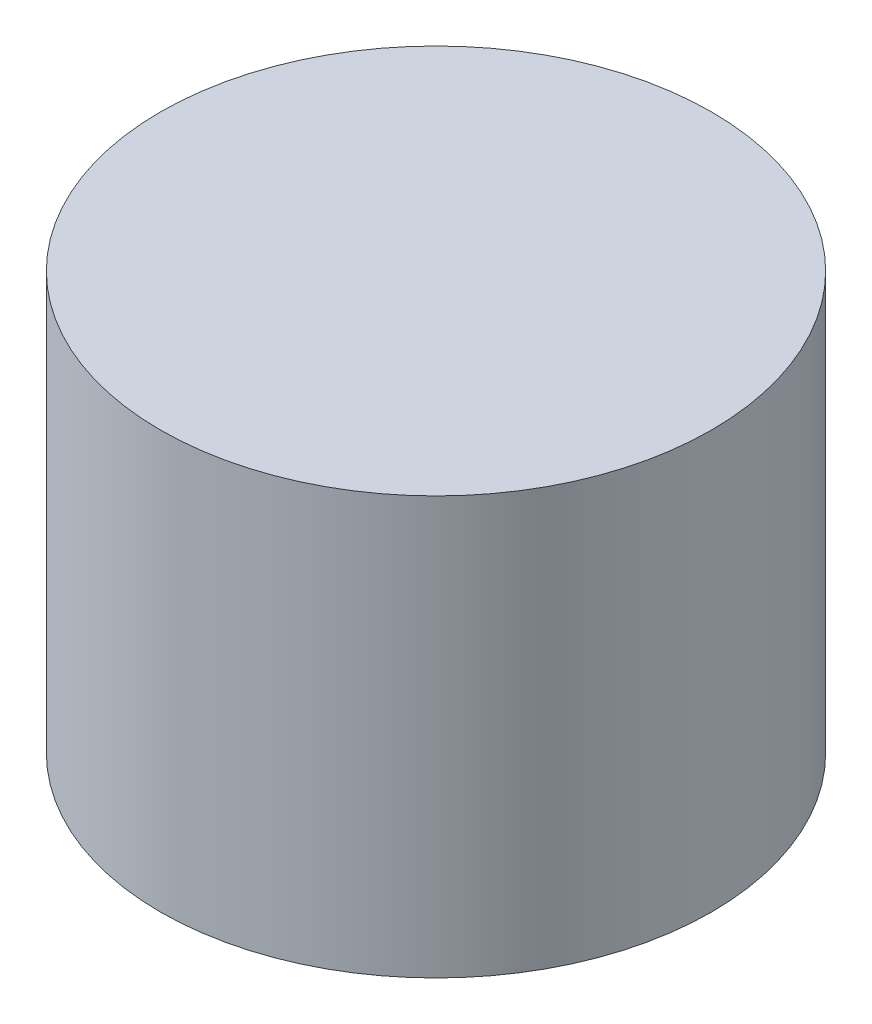
ISO-10303-21;
HEADER;
FILE_DESCRIPTION(('STEP AP214'),'2;1');
FILE_NAME('part.step','',(''),(''),'','','');
FILE_SCHEMA(('AUTOMOTIVE_DESIGN { 1 0 10303 214 1 1 1 1 }'));
ENDSEC;
DATA;
#1=APPLICATION_CONTEXT('core data for automotive mechanical design processes');
#2=APPLICATION_PROTOCOL_DEFINITION('international standard','automotive_design',2000,#1);
#3=PRODUCT_CONTEXT('',#1,'mechanical');
#4=PRODUCT('Part','Part','',(#3));
#5=PRODUCT_RELATED_PRODUCT_CATEGORY('part','',(#4));
#6=PRODUCT_DEFINITION_FORMATION('','',#4);
#7=PRODUCT_DEFINITION_CONTEXT('part definition',#1,'design');
#8=PRODUCT_DEFINITION('design','',#6,#7);
#9=PRODUCT_DEFINITION_SHAPE('','',#8);
#10=(LENGTH_UNIT() NAMED_UNIT(*) SI_UNIT(.MILLI.,.METRE.));
#11=(NAMED_UNIT(*) PLANE_ANGLE_UNIT() SI_UNIT($,.RADIAN.));
#12=(NAMED_UNIT(*) SI_UNIT($,.STERADIAN.) SOLID_ANGLE_UNIT());
#13=UNCERTAINTY_MEASURE_WITH_UNIT(LENGTH_MEASURE(1.E-05),#10,'distance_accuracy_value','');
#14=(GEOMETRIC_REPRESENTATION_CONTEXT(3) GLOBAL_UNCERTAINTY_ASSIGNED_CONTEXT((#13)) GLOBAL_UNIT_ASSIGNED_CONTEXT((#10,
#11,#12)) REPRESENTATION_CONTEXT('',''));
#15=CARTESIAN_POINT('',(0.,0.,0.));
#16=DIRECTION('',(0.,0.,1.));
#17=DIRECTION('',(1.,0.,0.));
#18=AXIS2_PLACEMENT_3D('',#15,#16,#17);
#19=CARTESIAN_POINT('',(0.,100.,0.));
#20=DIRECTION('',(0.,-1.,0.));
#21=DIRECTION('',(0.,0.,-1.));
#22=AXIS2_PLACEMENT_3D('',#19,#20,#21);
#23=CYLINDRICAL_SURFACE('',#22,66.);
#24=CARTESIAN_POINT('',(0.,100.,0.));
#25=DIRECTION('',(0.,1.,0.));
#26=DIRECTION('',(0.,0.,1.));
#27=AXIS2_PLACEMENT_3D('',#24,#25,#26);
#28=CIRCLE('',#27,66.);
#29=CARTESIAN_POINT('',(0.,100.,66.));
#30=VERTEX_POINT('',#29);
#31=EDGE_CURVE('E10',#30,#30,#28,.T.);
#32=ORIENTED_EDGE('',*,*,#31,.F.);
#33=EDGE_LOOP('',(#32));
#34=FACE_BOUND('',#33,.T.);
#35=CARTESIAN_POINT('',(0.,0.,0.));
#36=DIRECTION('',(0.,1.,0.));
#37=DIRECTION('',(0.,0.,1.));
#38=AXIS2_PLACEMENT_3D('',#35,#36,#37);
#39=CIRCLE('',#38,66.);
#40=CARTESIAN_POINT('',(0.,0.,66.));
#41=VERTEX_POINT('',#40);
#42=EDGE_CURVE('E40',#41,#41,#39,.T.);
#43=ORIENTED_EDGE('',*,*,#42,.T.);
#44=EDGE_LOOP('',(#43));
#45=FACE_BOUND('',#44,.T.);
#46=ADVANCED_FACE('F37',(#34,#45),#23,.T.);
#47=CARTESIAN_POINT('',(0.,100.,0.));
#48=DIRECTION('',(0.,1.,0.));
#49=DIRECTION('',(0.,0.,1.));
#50=AXIS2_PLACEMENT_3D('',#47,#48,#49);
#51=PLANE('',#50);
#52=ORIENTED_EDGE('',*,*,#31,.T.);
#53=EDGE_LOOP('',(#52));
#54=FACE_BOUND('',#53,.T.);
#55=ADVANCED_FACE('F54',(#54),#51,.T.);
#56=CARTESIAN_POINT('',(0.,0.,0.));
#57=DIRECTION('',(0.,1.,0.));
#58=DIRECTION('',(0.,0.,1.));
#59=AXIS2_PLACEMENT_3D('',#56,#57,#58);
#60=PLANE('',#59);
#61=ORIENTED_EDGE('',*,*,#42,.F.);
#62=EDGE_LOOP('',(#61));
#63=FACE_BOUND('',#62,.T.);
#64=ADVANCED_FACE('F52',(#63),#60,.F.);
#65=CLOSED_SHELL('',(#46,#55,#64));
#66=MANIFOLD_SOLID_BREP('B2',#65);
#67=ADVANCED_BREP_SHAPE_REPRESENTATION('',(#18,#66),#14);
#68=SHAPE_DEFINITION_REPRESENTATION(#9,#67);
ENDSEC;
END-ISO-10303-21;
